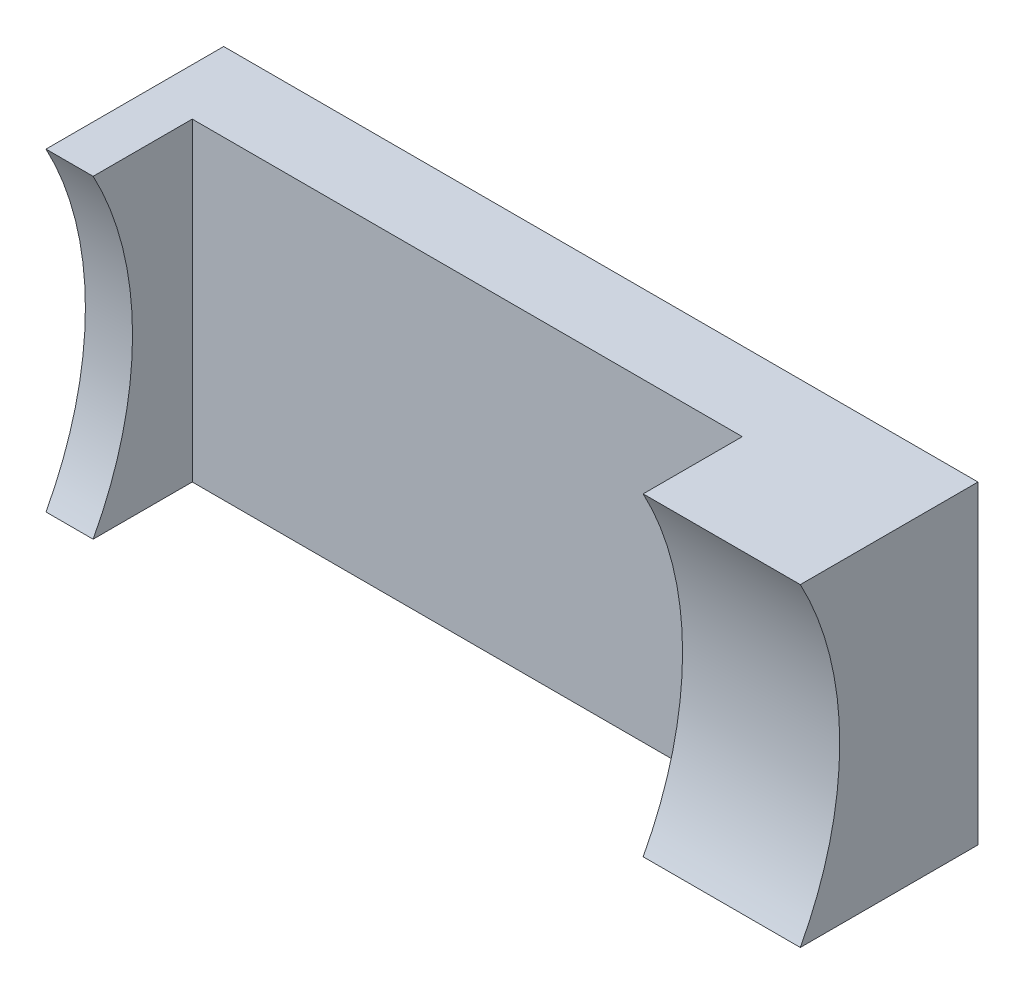
ISO-10303-21;
HEADER;
FILE_DESCRIPTION(('STEP AP214'),'2;1');
FILE_NAME('part.step','',(''),(''),'','','');
FILE_SCHEMA(('AUTOMOTIVE_DESIGN { 1 0 10303 214 1 1 1 1 }'));
ENDSEC;
DATA;
#1=APPLICATION_CONTEXT('core data for automotive mechanical design processes');
#2=APPLICATION_PROTOCOL_DEFINITION('international standard','automotive_design',2000,#1);
#3=PRODUCT_CONTEXT('',#1,'mechanical');
#4=PRODUCT('Part','Part','',(#3));
#5=PRODUCT_RELATED_PRODUCT_CATEGORY('part','',(#4));
#6=PRODUCT_DEFINITION_FORMATION('','',#4);
#7=PRODUCT_DEFINITION_CONTEXT('part definition',#1,'design');
#8=PRODUCT_DEFINITION('design','',#6,#7);
#9=PRODUCT_DEFINITION_SHAPE('','',#8);
#10=(LENGTH_UNIT() NAMED_UNIT(*) SI_UNIT(.MILLI.,.METRE.));
#11=(NAMED_UNIT(*) PLANE_ANGLE_UNIT() SI_UNIT($,.RADIAN.));
#12=(NAMED_UNIT(*) SI_UNIT($,.STERADIAN.) SOLID_ANGLE_UNIT());
#13=UNCERTAINTY_MEASURE_WITH_UNIT(LENGTH_MEASURE(1.E-05),#10,'distance_accuracy_value','');
#14=(GEOMETRIC_REPRESENTATION_CONTEXT(3) GLOBAL_UNCERTAINTY_ASSIGNED_CONTEXT((#13)) GLOBAL_UNIT_ASSIGNED_CONTEXT((#10,
#11,#12)) REPRESENTATION_CONTEXT('',''));
#15=CARTESIAN_POINT('',(0.,0.,0.));
#16=DIRECTION('',(0.,0.,1.));
#17=DIRECTION('',(1.,0.,0.));
#18=AXIS2_PLACEMENT_3D('',#15,#16,#17);
#19=CARTESIAN_POINT('',(0.,0.,5.));
#20=DIRECTION('',(0.,0.,1.));
#21=DIRECTION('',(1.,0.,0.));
#22=AXIS2_PLACEMENT_3D('',#19,#20,#21);
#23=PLANE('',#22);
#24=DIRECTION('',(1.,0.,0.));
#25=VECTOR('',#24,1.);
#26=CARTESIAN_POINT('',(24.,-10.,5.));
#27=LINE('',#26,#25);
#28=CARTESIAN_POINT('',(-21.,-10.,5.));
#29=VERTEX_POINT('',#28);
#30=CARTESIAN_POINT('',(14.,-10.,5.));
#31=VERTEX_POINT('',#30);
#32=EDGE_CURVE('E162',#29,#31,#27,.T.);
#33=ORIENTED_EDGE('',*,*,#32,.T.);
#34=DIRECTION('',(0.,-1.,0.));
#35=VECTOR('',#34,1.);
#36=CARTESIAN_POINT('',(14.,10.,5.));
#37=LINE('',#36,#35);
#38=CARTESIAN_POINT('',(14.,10.,5.));
#39=VERTEX_POINT('',#38);
#40=EDGE_CURVE('E182',#39,#31,#37,.T.);
#41=ORIENTED_EDGE('',*,*,#40,.F.);
#42=DIRECTION('',(-1.,0.,0.));
#43=VECTOR('',#42,1.);
#44=CARTESIAN_POINT('',(24.,10.,5.));
#45=LINE('',#44,#43);
#46=CARTESIAN_POINT('',(-21.,10.,5.));
#47=VERTEX_POINT('',#46);
#48=EDGE_CURVE('E158',#39,#47,#45,.T.);
#49=ORIENTED_EDGE('',*,*,#48,.T.);
#50=DIRECTION('',(0.,1.,0.));
#51=VECTOR('',#50,1.);
#52=CARTESIAN_POINT('',(-21.,10.,5.));
#53=LINE('',#52,#51);
#54=EDGE_CURVE('E176',#29,#47,#53,.T.);
#55=ORIENTED_EDGE('',*,*,#54,.F.);
#56=EDGE_LOOP('',(#33,#41,#49,#55));
#57=FACE_BOUND('',#56,.T.);
#58=ADVANCED_FACE('F38',(#57),#23,.T.);
#59=CARTESIAN_POINT('',(-24.,-10.,5.));
#60=DIRECTION('',(1.,0.,0.));
#61=DIRECTION('',(0.,0.,-1.));
#62=AXIS2_PLACEMENT_3D('',#59,#60,#61);
#63=PLANE('',#62);
#64=DIRECTION('',(0.,0.,-1.));
#65=VECTOR('',#64,1.);
#66=CARTESIAN_POINT('',(-24.,-10.,5.));
#67=LINE('',#66,#65);
#68=CARTESIAN_POINT('',(-24.,-10.,11.3066856871233));
#69=VERTEX_POINT('',#68);
#70=CARTESIAN_POINT('',(-24.,-10.,0.));
#71=VERTEX_POINT('',#70);
#72=EDGE_CURVE('E124',#69,#71,#67,.T.);
#73=ORIENTED_EDGE('',*,*,#72,.F.);
#74=CARTESIAN_POINT('',(-24.,0.,30.));
#75=DIRECTION('',(-1.,0.,0.));
#76=DIRECTION('',(0.,0.,1.));
#77=AXIS2_PLACEMENT_3D('',#74,#75,#76);
#78=CIRCLE('',#77,21.2);
#79=CARTESIAN_POINT('',(-24.,10.,11.3066856871233));
#80=VERTEX_POINT('',#79);
#81=EDGE_CURVE('E118',#80,#69,#78,.T.);
#82=ORIENTED_EDGE('',*,*,#81,.F.);
#83=DIRECTION('',(0.,0.,-1.));
#84=VECTOR('',#83,1.);
#85=CARTESIAN_POINT('',(-24.,10.,5.));
#86=LINE('',#85,#84);
#87=CARTESIAN_POINT('',(-24.,10.,0.));
#88=VERTEX_POINT('',#87);
#89=EDGE_CURVE('E127',#80,#88,#86,.T.);
#90=ORIENTED_EDGE('',*,*,#89,.T.);
#91=DIRECTION('',(0.,-1.,0.));
#92=VECTOR('',#91,1.);
#93=CARTESIAN_POINT('',(-24.,-10.,0.));
#94=LINE('',#93,#92);
#95=EDGE_CURVE('E146',#88,#71,#94,.T.);
#96=ORIENTED_EDGE('',*,*,#95,.T.);
#97=EDGE_LOOP('',(#73,#82,#90,#96));
#98=FACE_BOUND('',#97,.T.);
#99=ADVANCED_FACE('F40',(#98),#63,.F.);
#100=CARTESIAN_POINT('',(24.,-10.,5.));
#101=DIRECTION('',(0.,1.,0.));
#102=DIRECTION('',(-1.,0.,0.));
#103=AXIS2_PLACEMENT_3D('',#100,#101,#102);
#104=PLANE('',#103);
#105=DIRECTION('',(0.,0.,-1.));
#106=VECTOR('',#105,1.);
#107=CARTESIAN_POINT('',(24.,-10.,5.));
#108=LINE('',#107,#106);
#109=CARTESIAN_POINT('',(24.,-10.,11.3066856871233));
#110=VERTEX_POINT('',#109);
#111=CARTESIAN_POINT('',(24.,-10.,0.));
#112=VERTEX_POINT('',#111);
#113=EDGE_CURVE('E115',#110,#112,#108,.T.);
#114=ORIENTED_EDGE('',*,*,#113,.F.);
#115=DIRECTION('',(-1.,0.,0.));
#116=VECTOR('',#115,1.);
#117=CARTESIAN_POINT('',(83.9626550446193,-9.99999999999999,11.3066856871233));
#118=LINE('',#117,#116);
#119=CARTESIAN_POINT('',(14.,-10.,11.3066856871233));
#120=VERTEX_POINT('',#119);
#121=EDGE_CURVE('E101',#110,#120,#118,.T.);
#122=ORIENTED_EDGE('',*,*,#121,.T.);
#123=DIRECTION('',(0.,0.,-1.));
#124=VECTOR('',#123,1.);
#125=CARTESIAN_POINT('',(14.,-10.,30.));
#126=LINE('',#125,#124);
#127=EDGE_CURVE('E180',#120,#31,#126,.T.);
#128=ORIENTED_EDGE('',*,*,#127,.T.);
#129=ORIENTED_EDGE('',*,*,#32,.F.);
#130=DIRECTION('',(0.,0.,-1.));
#131=VECTOR('',#130,1.);
#132=CARTESIAN_POINT('',(-21.,-10.,30.));
#133=LINE('',#132,#131);
#134=CARTESIAN_POINT('',(-21.,-10.,11.3066856871233));
#135=VERTEX_POINT('',#134);
#136=EDGE_CURVE('E151',#135,#29,#133,.T.);
#137=ORIENTED_EDGE('',*,*,#136,.F.);
#138=EDGE_CURVE('E53',#135,#69,#118,.T.);
#139=ORIENTED_EDGE('',*,*,#138,.T.);
#140=ORIENTED_EDGE('',*,*,#72,.T.);
#141=DIRECTION('',(1.,0.,0.));
#142=VECTOR('',#141,1.);
#143=CARTESIAN_POINT('',(24.,-10.,0.));
#144=LINE('',#143,#142);
#145=EDGE_CURVE('E122',#71,#112,#144,.T.);
#146=ORIENTED_EDGE('',*,*,#145,.T.);
#147=EDGE_LOOP('',(#114,#122,#128,#129,#137,#139,#140,#146));
#148=FACE_BOUND('',#147,.T.);
#149=ADVANCED_FACE('F120',(#148),#104,.F.);
#150=CARTESIAN_POINT('',(24.,-10.,5.));
#151=DIRECTION('',(-1.,0.,0.));
#152=DIRECTION('',(0.,0.,1.));
#153=AXIS2_PLACEMENT_3D('',#150,#151,#152);
#154=PLANE('',#153);
#155=DIRECTION('',(0.,0.,-1.));
#156=VECTOR('',#155,1.);
#157=CARTESIAN_POINT('',(24.,10.,5.));
#158=LINE('',#157,#156);
#159=CARTESIAN_POINT('',(24.,10.,11.3066856871233));
#160=VERTEX_POINT('',#159);
#161=CARTESIAN_POINT('',(24.,10.,0.));
#162=VERTEX_POINT('',#161);
#163=EDGE_CURVE('E117',#160,#162,#158,.T.);
#164=ORIENTED_EDGE('',*,*,#163,.F.);
#165=CARTESIAN_POINT('',(24.,0.,30.));
#166=DIRECTION('',(-1.,0.,0.));
#167=DIRECTION('',(0.,0.,1.));
#168=AXIS2_PLACEMENT_3D('',#165,#166,#167);
#169=CIRCLE('',#168,21.2);
#170=EDGE_CURVE('E104',#110,#160,#169,.F.);
#171=ORIENTED_EDGE('',*,*,#170,.F.);
#172=ORIENTED_EDGE('',*,*,#113,.T.);
#173=DIRECTION('',(0.,1.,0.));
#174=VECTOR('',#173,1.);
#175=CARTESIAN_POINT('',(24.,-10.,0.));
#176=LINE('',#175,#174);
#177=EDGE_CURVE('E153',#112,#162,#176,.T.);
#178=ORIENTED_EDGE('',*,*,#177,.T.);
#179=EDGE_LOOP('',(#164,#171,#172,#178));
#180=FACE_BOUND('',#179,.T.);
#181=ADVANCED_FACE('F113',(#180),#154,.F.);
#182=CARTESIAN_POINT('',(24.,10.,5.));
#183=DIRECTION('',(0.,-1.,0.));
#184=DIRECTION('',(1.,0.,0.));
#185=AXIS2_PLACEMENT_3D('',#182,#183,#184);
#186=PLANE('',#185);
#187=ORIENTED_EDGE('',*,*,#89,.F.);
#188=DIRECTION('',(-1.,0.,0.));
#189=VECTOR('',#188,1.);
#190=CARTESIAN_POINT('',(83.9626550446193,10.,11.3066856871233));
#191=LINE('',#190,#189);
#192=CARTESIAN_POINT('',(-21.,10.,11.3066856871233));
#193=VERTEX_POINT('',#192);
#194=EDGE_CURVE('E184',#80,#193,#191,.F.);
#195=ORIENTED_EDGE('',*,*,#194,.T.);
#196=DIRECTION('',(0.,0.,-1.));
#197=VECTOR('',#196,1.);
#198=CARTESIAN_POINT('',(-21.,10.,30.));
#199=LINE('',#198,#197);
#200=EDGE_CURVE('E155',#193,#47,#199,.T.);
#201=ORIENTED_EDGE('',*,*,#200,.T.);
#202=ORIENTED_EDGE('',*,*,#48,.F.);
#203=DIRECTION('',(0.,0.,-1.));
#204=VECTOR('',#203,1.);
#205=CARTESIAN_POINT('',(14.,10.,30.));
#206=LINE('',#205,#204);
#207=CARTESIAN_POINT('',(14.,10.,11.3066856871233));
#208=VERTEX_POINT('',#207);
#209=EDGE_CURVE('E178',#208,#39,#206,.T.);
#210=ORIENTED_EDGE('',*,*,#209,.F.);
#211=EDGE_CURVE('E61',#208,#160,#191,.F.);
#212=ORIENTED_EDGE('',*,*,#211,.T.);
#213=ORIENTED_EDGE('',*,*,#163,.T.);
#214=DIRECTION('',(-1.,0.,0.));
#215=VECTOR('',#214,1.);
#216=CARTESIAN_POINT('',(24.,10.,0.));
#217=LINE('',#216,#215);
#218=EDGE_CURVE('E148',#162,#88,#217,.T.);
#219=ORIENTED_EDGE('',*,*,#218,.T.);
#220=EDGE_LOOP('',(#187,#195,#201,#202,#210,#212,#213,#219));
#221=FACE_BOUND('',#220,.T.);
#222=ADVANCED_FACE('F140',(#221),#186,.F.);
#223=CARTESIAN_POINT('',(0.,0.,0.));
#224=DIRECTION('',(0.,0.,1.));
#225=DIRECTION('',(1.,0.,0.));
#226=AXIS2_PLACEMENT_3D('',#223,#224,#225);
#227=PLANE('',#226);
#228=CARTESIAN_POINT('',(-11.,0.,0.));
#229=DIRECTION('',(0.,0.,1.));
#230=DIRECTION('',(1.,0.,0.));
#231=AXIS2_PLACEMENT_3D('',#228,#229,#230);
#232=CIRCLE('',#231,2.5);
#233=CARTESIAN_POINT('',(-8.5,0.,0.));
#234=VERTEX_POINT('',#233);
#235=EDGE_CURVE('E11',#234,#234,#232,.F.);
#236=ORIENTED_EDGE('',*,*,#235,.F.);
#237=EDGE_LOOP('',(#236));
#238=FACE_BOUND('',#237,.T.);
#239=CARTESIAN_POINT('',(9.,0.,0.));
#240=DIRECTION('',(0.,0.,1.));
#241=DIRECTION('',(1.,0.,0.));
#242=AXIS2_PLACEMENT_3D('',#239,#240,#241);
#243=CIRCLE('',#242,2.5);
#244=CARTESIAN_POINT('',(11.5,0.,0.));
#245=VERTEX_POINT('',#244);
#246=EDGE_CURVE('E46',#245,#245,#243,.F.);
#247=ORIENTED_EDGE('',*,*,#246,.F.);
#248=EDGE_LOOP('',(#247));
#249=FACE_BOUND('',#248,.T.);
#250=ORIENTED_EDGE('',*,*,#95,.F.);
#251=ORIENTED_EDGE('',*,*,#218,.F.);
#252=ORIENTED_EDGE('',*,*,#177,.F.);
#253=ORIENTED_EDGE('',*,*,#145,.F.);
#254=EDGE_LOOP('',(#250,#251,#252,#253));
#255=FACE_BOUND('',#254,.T.);
#256=ADVANCED_FACE('F136',(#238,#249,#255),#227,.F.);
#257=CARTESIAN_POINT('',(-21.,10.,30.));
#258=DIRECTION('',(-1.,0.,0.));
#259=DIRECTION('',(0.,-1.,0.));
#260=AXIS2_PLACEMENT_3D('',#257,#258,#259);
#261=PLANE('',#260);
#262=ORIENTED_EDGE('',*,*,#200,.F.);
#263=CARTESIAN_POINT('',(-21.,0.,30.));
#264=DIRECTION('',(-1.,0.,0.));
#265=DIRECTION('',(0.,-1.,0.));
#266=AXIS2_PLACEMENT_3D('',#263,#264,#265);
#267=CIRCLE('',#266,21.2);
#268=EDGE_CURVE('E109',#193,#135,#267,.T.);
#269=ORIENTED_EDGE('',*,*,#268,.T.);
#270=ORIENTED_EDGE('',*,*,#136,.T.);
#271=ORIENTED_EDGE('',*,*,#54,.T.);
#272=EDGE_LOOP('',(#262,#269,#270,#271));
#273=FACE_BOUND('',#272,.T.);
#274=ADVANCED_FACE('F139',(#273),#261,.F.);
#275=CARTESIAN_POINT('',(14.,10.,30.));
#276=DIRECTION('',(1.,0.,0.));
#277=DIRECTION('',(0.,1.,0.));
#278=AXIS2_PLACEMENT_3D('',#275,#276,#277);
#279=PLANE('',#278);
#280=ORIENTED_EDGE('',*,*,#127,.F.);
#281=CARTESIAN_POINT('',(14.,0.,30.));
#282=DIRECTION('',(1.,0.,0.));
#283=DIRECTION('',(0.,1.,0.));
#284=AXIS2_PLACEMENT_3D('',#281,#282,#283);
#285=CIRCLE('',#284,21.2);
#286=EDGE_CURVE('E105',#120,#208,#285,.T.);
#287=ORIENTED_EDGE('',*,*,#286,.T.);
#288=ORIENTED_EDGE('',*,*,#209,.T.);
#289=ORIENTED_EDGE('',*,*,#40,.T.);
#290=EDGE_LOOP('',(#280,#287,#288,#289));
#291=FACE_BOUND('',#290,.T.);
#292=ADVANCED_FACE('F247',(#291),#279,.F.);
#293=CARTESIAN_POINT('',(83.9626550446193,0.,30.));
#294=DIRECTION('',(-1.,0.,0.));
#295=DIRECTION('',(0.,0.,1.));
#296=AXIS2_PLACEMENT_3D('',#293,#294,#295);
#297=CYLINDRICAL_SURFACE('',#296,21.2);
#298=ORIENTED_EDGE('',*,*,#170,.T.);
#299=ORIENTED_EDGE('',*,*,#211,.F.);
#300=ORIENTED_EDGE('',*,*,#286,.F.);
#301=ORIENTED_EDGE('',*,*,#121,.F.);
#302=EDGE_LOOP('',(#298,#299,#300,#301));
#303=FACE_BOUND('',#302,.T.);
#304=ADVANCED_FACE('F103',(#303),#297,.F.);
#305=ORIENTED_EDGE('',*,*,#268,.F.);
#306=ORIENTED_EDGE('',*,*,#194,.F.);
#307=ORIENTED_EDGE('',*,*,#81,.T.);
#308=ORIENTED_EDGE('',*,*,#138,.F.);
#309=EDGE_LOOP('',(#305,#306,#307,#308));
#310=FACE_BOUND('',#309,.T.);
#311=ADVANCED_FACE('F260',(#310),#297,.F.);
#312=CARTESIAN_POINT('',(9.,0.,-5.));
#313=DIRECTION('',(0.,0.,1.));
#314=DIRECTION('',(1.,0.,0.));
#315=AXIS2_PLACEMENT_3D('',#312,#313,#314);
#316=CYLINDRICAL_SURFACE('',#315,2.5);
#317=CARTESIAN_POINT('',(9.,0.,-5.));
#318=DIRECTION('',(0.,0.,-1.));
#319=DIRECTION('',(-1.,0.,0.));
#320=AXIS2_PLACEMENT_3D('',#317,#318,#319);
#321=CIRCLE('',#320,2.5);
#322=CARTESIAN_POINT('',(6.5,0.,-5.));
#323=VERTEX_POINT('',#322);
#324=EDGE_CURVE('E188',#323,#323,#321,.T.);
#325=ORIENTED_EDGE('',*,*,#324,.F.);
#326=EDGE_LOOP('',(#325));
#327=FACE_BOUND('',#326,.T.);
#328=ORIENTED_EDGE('',*,*,#246,.T.);
#329=EDGE_LOOP('',(#328));
#330=FACE_BOUND('',#329,.T.);
#331=ADVANCED_FACE('F134',(#327,#330),#316,.T.);
#332=CARTESIAN_POINT('',(9.,0.,-5.));
#333=DIRECTION('',(0.,0.,-1.));
#334=DIRECTION('',(-1.,0.,0.));
#335=AXIS2_PLACEMENT_3D('',#332,#333,#334);
#336=PLANE('',#335);
#337=ORIENTED_EDGE('',*,*,#324,.T.);
#338=EDGE_LOOP('',(#337));
#339=FACE_BOUND('',#338,.T.);
#340=ADVANCED_FACE('F200',(#339),#336,.T.);
#341=CARTESIAN_POINT('',(-11.,0.,-5.));
#342=DIRECTION('',(0.,0.,1.));
#343=DIRECTION('',(1.,0.,0.));
#344=AXIS2_PLACEMENT_3D('',#341,#342,#343);
#345=CYLINDRICAL_SURFACE('',#344,2.5);
#346=CARTESIAN_POINT('',(-11.,0.,-5.));
#347=DIRECTION('',(0.,0.,-1.));
#348=DIRECTION('',(-1.,0.,0.));
#349=AXIS2_PLACEMENT_3D('',#346,#347,#348);
#350=CIRCLE('',#349,2.5);
#351=CARTESIAN_POINT('',(-13.5,0.,-5.));
#352=VERTEX_POINT('',#351);
#353=EDGE_CURVE('E191',#352,#352,#350,.T.);
#354=ORIENTED_EDGE('',*,*,#353,.F.);
#355=EDGE_LOOP('',(#354));
#356=FACE_BOUND('',#355,.T.);
#357=ORIENTED_EDGE('',*,*,#235,.T.);
#358=EDGE_LOOP('',(#357));
#359=FACE_BOUND('',#358,.T.);
#360=ADVANCED_FACE('F197',(#356,#359),#345,.T.);
#361=CARTESIAN_POINT('',(-11.,0.,-5.));
#362=DIRECTION('',(0.,0.,-1.));
#363=DIRECTION('',(-1.,0.,0.));
#364=AXIS2_PLACEMENT_3D('',#361,#362,#363);
#365=PLANE('',#364);
#366=ORIENTED_EDGE('',*,*,#353,.T.);
#367=EDGE_LOOP('',(#366));
#368=FACE_BOUND('',#367,.T.);
#369=ADVANCED_FACE('F195',(#368),#365,.T.);
#370=CLOSED_SHELL('',(#58,#99,#149,#181,#222,#256,#274,#292,#304,#311,#331,#340,#360,#369));
#371=MANIFOLD_SOLID_BREP('B2',#370);
#372=ADVANCED_BREP_SHAPE_REPRESENTATION('',(#18,#371),#14);
#373=SHAPE_DEFINITION_REPRESENTATION(#9,#372);
ENDSEC;
END-ISO-10303-21;
